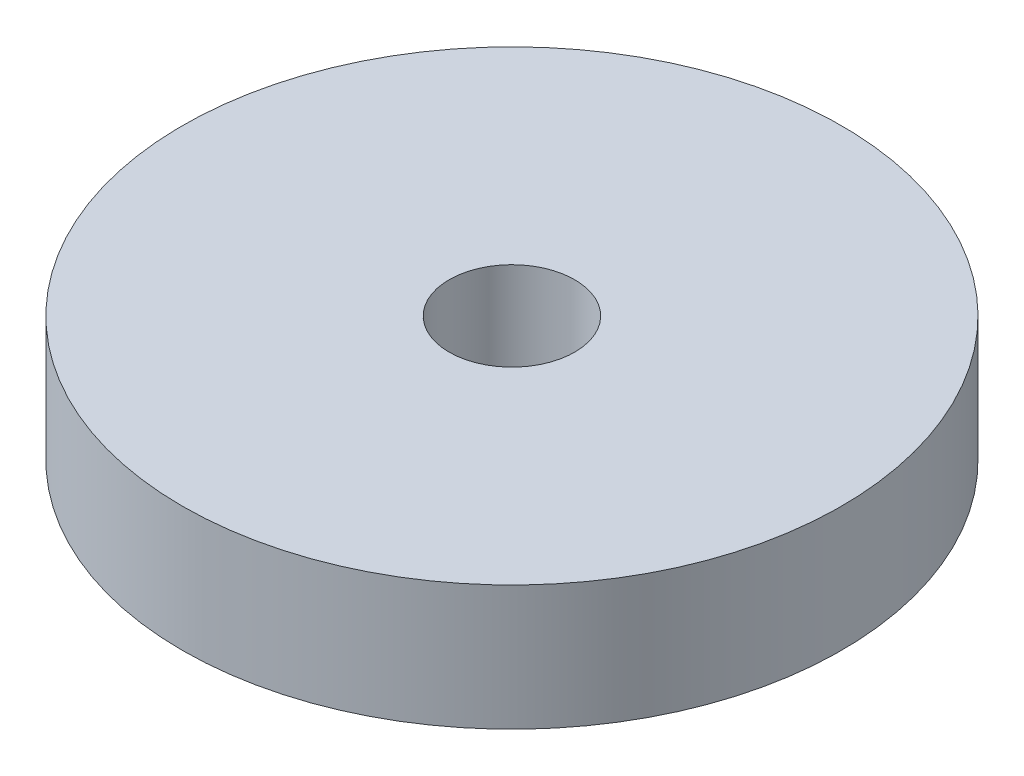
ISO-10303-21;
HEADER;
FILE_DESCRIPTION(('STEP AP214'),'2;1');
FILE_NAME('part.step','',(''),(''),'','','');
FILE_SCHEMA(('AUTOMOTIVE_DESIGN { 1 0 10303 214 1 1 1 1 }'));
ENDSEC;
DATA;
#1=APPLICATION_CONTEXT('core data for automotive mechanical design processes');
#2=APPLICATION_PROTOCOL_DEFINITION('international standard','automotive_design',2000,#1);
#3=PRODUCT_CONTEXT('',#1,'mechanical');
#4=PRODUCT('Part','Part','',(#3));
#5=PRODUCT_RELATED_PRODUCT_CATEGORY('part','',(#4));
#6=PRODUCT_DEFINITION_FORMATION('','',#4);
#7=PRODUCT_DEFINITION_CONTEXT('part definition',#1,'design');
#8=PRODUCT_DEFINITION('design','',#6,#7);
#9=PRODUCT_DEFINITION_SHAPE('','',#8);
#10=(LENGTH_UNIT() NAMED_UNIT(*) SI_UNIT(.MILLI.,.METRE.));
#11=(NAMED_UNIT(*) PLANE_ANGLE_UNIT() SI_UNIT($,.RADIAN.));
#12=(NAMED_UNIT(*) SI_UNIT($,.STERADIAN.) SOLID_ANGLE_UNIT());
#13=UNCERTAINTY_MEASURE_WITH_UNIT(LENGTH_MEASURE(1.E-05),#10,'distance_accuracy_value','');
#14=(GEOMETRIC_REPRESENTATION_CONTEXT(3) GLOBAL_UNCERTAINTY_ASSIGNED_CONTEXT((#13)) GLOBAL_UNIT_ASSIGNED_CONTEXT((#10,
#11,#12)) REPRESENTATION_CONTEXT('',''));
#15=CARTESIAN_POINT('',(0.,0.,0.));
#16=DIRECTION('',(0.,0.,1.));
#17=DIRECTION('',(1.,0.,0.));
#18=AXIS2_PLACEMENT_3D('',#15,#16,#17);
#19=CARTESIAN_POINT('',(0.,10.16,0.));
#20=DIRECTION('',(0.,-1.,0.));
#21=DIRECTION('',(0.,0.,-1.));
#22=AXIS2_PLACEMENT_3D('',#19,#20,#21);
#23=CYLINDRICAL_SURFACE('',#22,14.986);
#24=CARTESIAN_POINT('',(0.,10.16,0.));
#25=DIRECTION('',(0.,1.,0.));
#26=DIRECTION('',(0.,0.,1.));
#27=AXIS2_PLACEMENT_3D('',#24,#25,#26);
#28=CIRCLE('',#27,14.986);
#29=CARTESIAN_POINT('',(0.,10.16,14.986));
#30=VERTEX_POINT('',#29);
#31=EDGE_CURVE('E10',#30,#30,#28,.T.);
#32=ORIENTED_EDGE('',*,*,#31,.F.);
#33=EDGE_LOOP('',(#32));
#34=FACE_BOUND('',#33,.T.);
#35=CARTESIAN_POINT('',(0.,0.,0.));
#36=DIRECTION('',(0.,1.,0.));
#37=DIRECTION('',(0.,0.,1.));
#38=AXIS2_PLACEMENT_3D('',#35,#36,#37);
#39=CIRCLE('',#38,14.986);
#40=CARTESIAN_POINT('',(0.,0.,14.986));
#41=VERTEX_POINT('',#40);
#42=EDGE_CURVE('E48',#41,#41,#39,.T.);
#43=ORIENTED_EDGE('',*,*,#42,.T.);
#44=EDGE_LOOP('',(#43));
#45=FACE_BOUND('',#44,.T.);
#46=ADVANCED_FACE('F45',(#34,#45),#23,.T.);
#47=CARTESIAN_POINT('',(0.,0.,0.));
#48=DIRECTION('',(0.,1.,0.));
#49=DIRECTION('',(0.,0.,1.));
#50=AXIS2_PLACEMENT_3D('',#47,#48,#49);
#51=PLANE('',#50);
#52=CARTESIAN_POINT('',(0.,0.,0.));
#53=DIRECTION('',(0.,1.,0.));
#54=DIRECTION('',(0.,0.,1.));
#55=AXIS2_PLACEMENT_3D('',#52,#53,#54);
#56=CIRCLE('',#55,6.);
#57=CARTESIAN_POINT('',(0.,0.,6.));
#58=VERTEX_POINT('',#57);
#59=EDGE_CURVE('E65',#58,#58,#56,.T.);
#60=ORIENTED_EDGE('',*,*,#59,.T.);
#61=EDGE_LOOP('',(#60));
#62=FACE_BOUND('',#61,.T.);
#63=ORIENTED_EDGE('',*,*,#42,.F.);
#64=EDGE_LOOP('',(#63));
#65=FACE_BOUND('',#64,.T.);
#66=ADVANCED_FACE('F75',(#62,#65),#51,.F.);
#67=CARTESIAN_POINT('',(0.,22.098,0.));
#68=DIRECTION('',(0.,-1.,0.));
#69=DIRECTION('',(0.,0.,-1.));
#70=AXIS2_PLACEMENT_3D('',#67,#68,#69);
#71=CYLINDRICAL_SURFACE('',#70,31.496);
#72=CARTESIAN_POINT('',(0.,22.098,0.));
#73=DIRECTION('',(0.,1.,0.));
#74=DIRECTION('',(0.,0.,1.));
#75=AXIS2_PLACEMENT_3D('',#72,#73,#74);
#76=CIRCLE('',#75,31.496);
#77=CARTESIAN_POINT('',(0.,22.098,31.496));
#78=VERTEX_POINT('',#77);
#79=EDGE_CURVE('E59',#78,#78,#76,.T.);
#80=ORIENTED_EDGE('',*,*,#79,.F.);
#81=EDGE_LOOP('',(#80));
#82=FACE_BOUND('',#81,.T.);
#83=CARTESIAN_POINT('',(0.,10.16,0.));
#84=DIRECTION('',(0.,1.,0.));
#85=DIRECTION('',(0.,0.,1.));
#86=AXIS2_PLACEMENT_3D('',#83,#84,#85);
#87=CIRCLE('',#86,31.496);
#88=CARTESIAN_POINT('',(0.,10.16,31.496));
#89=VERTEX_POINT('',#88);
#90=EDGE_CURVE('E61',#89,#89,#87,.T.);
#91=ORIENTED_EDGE('',*,*,#90,.T.);
#92=EDGE_LOOP('',(#91));
#93=FACE_BOUND('',#92,.T.);
#94=ADVANCED_FACE('F88',(#82,#93),#71,.T.);
#95=CARTESIAN_POINT('',(0.,22.098,0.));
#96=DIRECTION('',(0.,1.,0.));
#97=DIRECTION('',(0.,0.,1.));
#98=AXIS2_PLACEMENT_3D('',#95,#96,#97);
#99=PLANE('',#98);
#100=CARTESIAN_POINT('',(0.,22.098,0.));
#101=DIRECTION('',(0.,1.,0.));
#102=DIRECTION('',(0.,0.,1.));
#103=AXIS2_PLACEMENT_3D('',#100,#101,#102);
#104=CIRCLE('',#103,6.);
#105=CARTESIAN_POINT('',(0.,22.098,6.));
#106=VERTEX_POINT('',#105);
#107=EDGE_CURVE('E68',#106,#106,#104,.T.);
#108=ORIENTED_EDGE('',*,*,#107,.F.);
#109=EDGE_LOOP('',(#108));
#110=FACE_BOUND('',#109,.T.);
#111=ORIENTED_EDGE('',*,*,#79,.T.);
#112=EDGE_LOOP('',(#111));
#113=FACE_BOUND('',#112,.T.);
#114=ADVANCED_FACE('F85',(#110,#113),#99,.T.);
#115=CARTESIAN_POINT('',(0.,10.16,0.));
#116=DIRECTION('',(0.,1.,0.));
#117=DIRECTION('',(0.,0.,1.));
#118=AXIS2_PLACEMENT_3D('',#115,#116,#117);
#119=PLANE('',#118);
#120=ORIENTED_EDGE('',*,*,#31,.T.);
#121=EDGE_LOOP('',(#120));
#122=FACE_BOUND('',#121,.T.);
#123=ORIENTED_EDGE('',*,*,#90,.F.);
#124=EDGE_LOOP('',(#123));
#125=FACE_BOUND('',#124,.T.);
#126=ADVANCED_FACE('F81',(#122,#125),#119,.F.);
#127=CARTESIAN_POINT('',(0.,0.,0.));
#128=DIRECTION('',(0.,1.,0.));
#129=DIRECTION('',(0.,0.,1.));
#130=AXIS2_PLACEMENT_3D('',#127,#128,#129);
#131=CYLINDRICAL_SURFACE('',#130,6.);
#132=ORIENTED_EDGE('',*,*,#59,.F.);
#133=EDGE_LOOP('',(#132));
#134=FACE_BOUND('',#133,.T.);
#135=ORIENTED_EDGE('',*,*,#107,.T.);
#136=EDGE_LOOP('',(#135));
#137=FACE_BOUND('',#136,.T.);
#138=ADVANCED_FACE('F78',(#134,#137),#131,.F.);
#139=CLOSED_SHELL('',(#46,#66,#94,#114,#126,#138));
#140=MANIFOLD_SOLID_BREP('B2',#139);
#141=ADVANCED_BREP_SHAPE_REPRESENTATION('',(#18,#140),#14);
#142=SHAPE_DEFINITION_REPRESENTATION(#9,#141);
ENDSEC;
END-ISO-10303-21;
